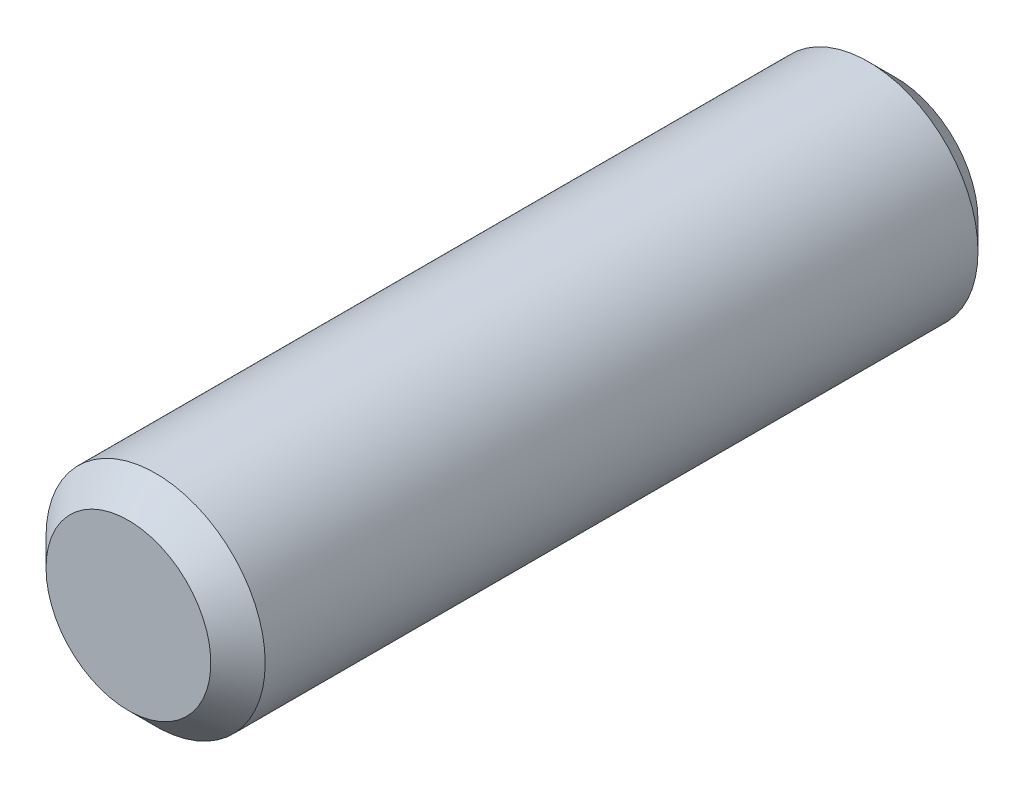
ISO-10303-21;
HEADER;
FILE_DESCRIPTION(('STEP AP214'),'2;1');
FILE_NAME('part.step','',(''),(''),'','','');
FILE_SCHEMA(('AUTOMOTIVE_DESIGN { 1 0 10303 214 1 1 1 1 }'));
ENDSEC;
DATA;
#1=APPLICATION_CONTEXT('core data for automotive mechanical design processes');
#2=APPLICATION_PROTOCOL_DEFINITION('international standard','automotive_design',2000,#1);
#3=PRODUCT_CONTEXT('',#1,'mechanical');
#4=PRODUCT('Part','Part','',(#3));
#5=PRODUCT_RELATED_PRODUCT_CATEGORY('part','',(#4));
#6=PRODUCT_DEFINITION_FORMATION('','',#4);
#7=PRODUCT_DEFINITION_CONTEXT('part definition',#1,'design');
#8=PRODUCT_DEFINITION('design','',#6,#7);
#9=PRODUCT_DEFINITION_SHAPE('','',#8);
#10=(LENGTH_UNIT() NAMED_UNIT(*) SI_UNIT(.MILLI.,.METRE.));
#11=(NAMED_UNIT(*) PLANE_ANGLE_UNIT() SI_UNIT($,.RADIAN.));
#12=(NAMED_UNIT(*) SI_UNIT($,.STERADIAN.) SOLID_ANGLE_UNIT());
#13=UNCERTAINTY_MEASURE_WITH_UNIT(LENGTH_MEASURE(1.E-05),#10,'distance_accuracy_value','');
#14=(GEOMETRIC_REPRESENTATION_CONTEXT(3) GLOBAL_UNCERTAINTY_ASSIGNED_CONTEXT((#13)) GLOBAL_UNIT_ASSIGNED_CONTEXT((#10,
#11,#12)) REPRESENTATION_CONTEXT('',''));
#15=CARTESIAN_POINT('',(0.,0.,0.));
#16=DIRECTION('',(0.,0.,1.));
#17=DIRECTION('',(1.,0.,0.));
#18=AXIS2_PLACEMENT_3D('',#15,#16,#17);
#19=CARTESIAN_POINT('',(-2.3976,-2.3976,22.225));
#20=DIRECTION('',(0.,0.,1.));
#21=DIRECTION('',(1.,0.,0.));
#22=AXIS2_PLACEMENT_3D('',#19,#20,#21);
#23=PLANE('',#22);
#24=CARTESIAN_POINT('',(0.,0.,22.225));
#25=DIRECTION('',(0.,0.,-1.));
#26=DIRECTION('',(-1.,0.,0.));
#27=AXIS2_PLACEMENT_3D('',#24,#25,#26);
#28=CIRCLE('',#27,2.38760000000001);
#29=CARTESIAN_POINT('',(-2.38760000000001,0.,22.225));
#30=VERTEX_POINT('',#29);
#31=EDGE_CURVE('E18',#30,#30,#28,.T.);
#32=ORIENTED_EDGE('',*,*,#31,.F.);
#33=EDGE_LOOP('',(#32));
#34=FACE_BOUND('',#33,.T.);
#35=ADVANCED_FACE('F14',(#34),#23,.T.);
#36=CARTESIAN_POINT('',(0.,0.,21.4376));
#37=DIRECTION('',(0.,0.,-1.));
#38=DIRECTION('',(-1.,0.,0.));
#39=AXIS2_PLACEMENT_3D('',#36,#37,#38);
#40=CONICAL_SURFACE('',#39,3.175,0.785398163397447);
#41=ORIENTED_EDGE('',*,*,#31,.T.);
#42=EDGE_LOOP('',(#41));
#43=FACE_BOUND('',#42,.T.);
#44=CARTESIAN_POINT('',(0.,0.,21.4376));
#45=DIRECTION('',(0.,0.,-1.));
#46=DIRECTION('',(-1.,0.,0.));
#47=AXIS2_PLACEMENT_3D('',#44,#45,#46);
#48=CIRCLE('',#47,3.175);
#49=CARTESIAN_POINT('',(-3.175,0.,21.4376));
#50=VERTEX_POINT('',#49);
#51=EDGE_CURVE('E27',#50,#50,#48,.T.);
#52=ORIENTED_EDGE('',*,*,#51,.F.);
#53=EDGE_LOOP('',(#52));
#54=FACE_BOUND('',#53,.T.);
#55=ADVANCED_FACE('F35',(#43,#54),#40,.T.);
#56=CARTESIAN_POINT('',(2.3976,-2.3976,0.));
#57=DIRECTION('',(0.,0.,-1.));
#58=DIRECTION('',(-1.,0.,0.));
#59=AXIS2_PLACEMENT_3D('',#56,#57,#58);
#60=PLANE('',#59);
#61=CARTESIAN_POINT('',(0.,0.,0.));
#62=DIRECTION('',(0.,0.,1.));
#63=DIRECTION('',(1.,0.,0.));
#64=AXIS2_PLACEMENT_3D('',#61,#62,#63);
#65=CIRCLE('',#64,2.3876);
#66=CARTESIAN_POINT('',(2.3876,0.,0.));
#67=VERTEX_POINT('',#66);
#68=EDGE_CURVE('E22',#67,#67,#65,.T.);
#69=ORIENTED_EDGE('',*,*,#68,.F.);
#70=EDGE_LOOP('',(#69));
#71=FACE_BOUND('',#70,.T.);
#72=ADVANCED_FACE('F44',(#71),#60,.T.);
#73=CARTESIAN_POINT('',(0.,0.,21.4376));
#74=DIRECTION('',(0.,0.,-1.));
#75=DIRECTION('',(-1.,0.,0.));
#76=AXIS2_PLACEMENT_3D('',#73,#74,#75);
#77=CYLINDRICAL_SURFACE('',#76,3.175);
#78=CARTESIAN_POINT('',(0.,0.,0.7874));
#79=DIRECTION('',(0.,0.,-1.));
#80=DIRECTION('',(-1.,0.,0.));
#81=AXIS2_PLACEMENT_3D('',#78,#79,#80);
#82=CIRCLE('',#81,3.175);
#83=CARTESIAN_POINT('',(-3.175,0.,0.7874));
#84=VERTEX_POINT('',#83);
#85=EDGE_CURVE('E9',#84,#84,#82,.T.);
#86=ORIENTED_EDGE('',*,*,#85,.F.);
#87=EDGE_LOOP('',(#86));
#88=FACE_BOUND('',#87,.T.);
#89=ORIENTED_EDGE('',*,*,#51,.T.);
#90=EDGE_LOOP('',(#89));
#91=FACE_BOUND('',#90,.T.);
#92=ADVANCED_FACE('F47',(#88,#91),#77,.T.);
#93=CARTESIAN_POINT('',(0.,0.,0.));
#94=DIRECTION('',(0.,0.,1.));
#95=DIRECTION('',(1.,0.,0.));
#96=AXIS2_PLACEMENT_3D('',#93,#94,#95);
#97=CONICAL_SURFACE('',#96,2.3876,0.785398163397448);
#98=ORIENTED_EDGE('',*,*,#85,.T.);
#99=EDGE_LOOP('',(#98));
#100=FACE_BOUND('',#99,.T.);
#101=ORIENTED_EDGE('',*,*,#68,.T.);
#102=EDGE_LOOP('',(#101));
#103=FACE_BOUND('',#102,.T.);
#104=ADVANCED_FACE('F16',(#100,#103),#97,.T.);
#105=CLOSED_SHELL('',(#35,#55,#72,#92,#104));
#106=MANIFOLD_SOLID_BREP('B1',#105);
#107=ADVANCED_BREP_SHAPE_REPRESENTATION('',(#18,#106),#14);
#108=SHAPE_DEFINITION_REPRESENTATION(#9,#107);
ENDSEC;
END-ISO-10303-21;
